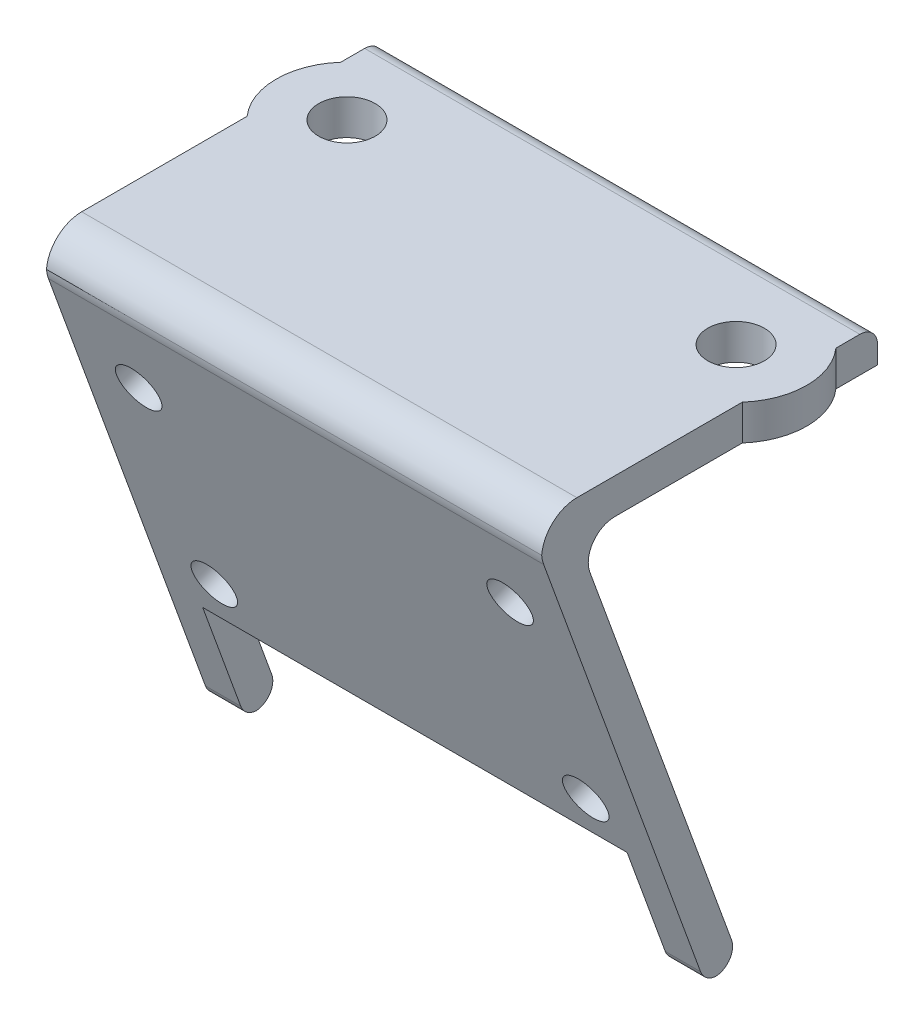
ISO-10303-21;
HEADER;
FILE_DESCRIPTION(('STEP AP214'),'2;1');
FILE_NAME('part.step','',(''),(''),'','','');
FILE_SCHEMA(('AUTOMOTIVE_DESIGN { 1 0 10303 214 1 1 1 1 }'));
ENDSEC;
DATA;
#1=APPLICATION_CONTEXT('core data for automotive mechanical design processes');
#2=APPLICATION_PROTOCOL_DEFINITION('international standard','automotive_design',2000,#1);
#3=PRODUCT_CONTEXT('',#1,'mechanical');
#4=PRODUCT('Part','Part','',(#3));
#5=PRODUCT_RELATED_PRODUCT_CATEGORY('part','',(#4));
#6=PRODUCT_DEFINITION_FORMATION('','',#4);
#7=PRODUCT_DEFINITION_CONTEXT('part definition',#1,'design');
#8=PRODUCT_DEFINITION('design','',#6,#7);
#9=PRODUCT_DEFINITION_SHAPE('','',#8);
#10=(LENGTH_UNIT() NAMED_UNIT(*) SI_UNIT(.MILLI.,.METRE.));
#11=(NAMED_UNIT(*) PLANE_ANGLE_UNIT() SI_UNIT($,.RADIAN.));
#12=(NAMED_UNIT(*) SI_UNIT($,.STERADIAN.) SOLID_ANGLE_UNIT());
#13=UNCERTAINTY_MEASURE_WITH_UNIT(LENGTH_MEASURE(1.E-05),#10,'distance_accuracy_value','');
#14=(GEOMETRIC_REPRESENTATION_CONTEXT(3) GLOBAL_UNCERTAINTY_ASSIGNED_CONTEXT((#13)) GLOBAL_UNIT_ASSIGNED_CONTEXT((#10,
#11,#12)) REPRESENTATION_CONTEXT('',''));
#15=CARTESIAN_POINT('',(0.,0.,0.));
#16=DIRECTION('',(0.,0.,1.));
#17=DIRECTION('',(1.,0.,0.));
#18=AXIS2_PLACEMENT_3D('',#15,#16,#17);
#19=CARTESIAN_POINT('',(-14.,2.,9.5));
#20=DIRECTION('',(1.,0.,0.));
#21=DIRECTION('',(0.,0.,-1.));
#22=AXIS2_PLACEMENT_3D('',#19,#20,#21);
#23=PLANE('',#22);
#24=DIRECTION('',(0.,0.,1.));
#25=VECTOR('',#24,1.);
#26=CARTESIAN_POINT('',(-14.,2.,9.5));
#27=LINE('',#26,#25);
#28=CARTESIAN_POINT('',(-14.,2.,-8.5));
#29=VERTEX_POINT('',#28);
#30=CARTESIAN_POINT('',(-14.,2.,-7.1457513110646));
#31=VERTEX_POINT('',#30);
#32=EDGE_CURVE('E287',#29,#31,#27,.T.);
#33=ORIENTED_EDGE('',*,*,#32,.F.);
#34=CARTESIAN_POINT('',(-14.,1.,-8.5));
#35=DIRECTION('',(1.,0.,0.));
#36=DIRECTION('',(0.,0.,-1.));
#37=AXIS2_PLACEMENT_3D('',#34,#35,#36);
#38=CIRCLE('',#37,1.);
#39=CARTESIAN_POINT('',(-14.,1.,-9.5));
#40=VERTEX_POINT('',#39);
#41=EDGE_CURVE('E57',#29,#40,#38,.F.);
#42=ORIENTED_EDGE('',*,*,#41,.T.);
#43=DIRECTION('',(0.,-1.,0.));
#44=VECTOR('',#43,1.);
#45=CARTESIAN_POINT('',(-14.,2.,-9.5));
#46=LINE('',#45,#44);
#47=CARTESIAN_POINT('',(-14.,0.,-9.5));
#48=VERTEX_POINT('',#47);
#49=EDGE_CURVE('E289',#40,#48,#46,.T.);
#50=ORIENTED_EDGE('',*,*,#49,.T.);
#51=DIRECTION('',(0.,0.,1.));
#52=VECTOR('',#51,1.);
#53=CARTESIAN_POINT('',(-14.,0.,9.5));
#54=LINE('',#53,#52);
#55=CARTESIAN_POINT('',(-14.,0.,-7.1457513110646));
#56=VERTEX_POINT('',#55);
#57=EDGE_CURVE('E296',#48,#56,#54,.T.);
#58=ORIENTED_EDGE('',*,*,#57,.T.);
#59=DIRECTION('',(0.,1.,0.));
#60=VECTOR('',#59,1.);
#61=CARTESIAN_POINT('',(-14.,-11.3137084989848,-7.1457513110646));
#62=LINE('',#61,#60);
#63=EDGE_CURVE('E255',#31,#56,#62,.F.);
#64=ORIENTED_EDGE('',*,*,#63,.F.);
#65=EDGE_LOOP('',(#33,#42,#50,#58,#64));
#66=FACE_BOUND('',#65,.T.);
#67=ADVANCED_FACE('F35',(#66),#23,.F.);
#68=DIRECTION('',(0.,-0.939692620785908,-0.34202014332567));
#69=VECTOR('',#68,1.);
#70=CARTESIAN_POINT('',(-14.,-25.3717007612195,-1.7345438697931));
#71=LINE('',#70,#69);
#72=CARTESIAN_POINT('',(-14.,-2.0130302149885,6.76731692106569));
#73=VERTEX_POINT('',#72);
#74=CARTESIAN_POINT('',(-14.,-24.0296806178938,-1.24608848383689));
#75=VERTEX_POINT('',#74);
#76=EDGE_CURVE('E237',#73,#75,#71,.T.);
#77=ORIENTED_EDGE('',*,*,#76,.T.);
#78=CARTESIAN_POINT('',(-14.,-24.3717007612195,-0.306395863050982));
#79=DIRECTION('',(1.,0.,0.));
#80=DIRECTION('',(0.,0.,-1.));
#81=AXIS2_PLACEMENT_3D('',#78,#79,#80);
#82=CIRCLE('',#81,1.);
#83=CARTESIAN_POINT('',(-14.,-25.3696392430509,-0.370573635526894));
#84=VERTEX_POINT('',#83);
#85=EDGE_CURVE('E341',#75,#84,#82,.F.);
#86=ORIENTED_EDGE('',*,*,#85,.T.);
#87=CARTESIAN_POINT('',(-14.,-24.3717007612195,-0.434751408002806));
#88=DIRECTION('',(1.,0.,0.));
#89=DIRECTION('',(0.,0.,-1.));
#90=AXIS2_PLACEMENT_3D('',#87,#88,#89);
#91=CIRCLE('',#90,1.);
#92=CARTESIAN_POINT('',(-14.,-24.7137209045452,0.5049412127831));
#93=VERTEX_POINT('',#92);
#94=EDGE_CURVE('E339',#84,#93,#91,.F.);
#95=ORIENTED_EDGE('',*,*,#94,.T.);
#96=DIRECTION('',(0.,0.939692620785908,0.34202014332567));
#97=VECTOR('',#96,1.);
#98=CARTESIAN_POINT('',(-14.,0.,9.5));
#99=LINE('',#98,#97);
#100=CARTESIAN_POINT('',(-14.,-0.33138632523441,9.37938524157182));
#101=VERTEX_POINT('',#100);
#102=EDGE_CURVE('E240',#93,#101,#99,.T.);
#103=ORIENTED_EDGE('',*,*,#102,.T.);
#104=CARTESIAN_POINT('',(-14.,0.352653961416931,7.5));
#105=DIRECTION('',(1.,0.,0.));
#106=DIRECTION('',(0.,0.,-1.));
#107=AXIS2_PLACEMENT_3D('',#104,#105,#106);
#108=CIRCLE('',#107,2.);
#109=CARTESIAN_POINT('',(-14.,0.176326980708465,9.49221203587225));
#110=VERTEX_POINT('',#109);
#111=EDGE_CURVE('E306',#101,#110,#108,.F.);
#112=ORIENTED_EDGE('',*,*,#111,.T.);
#113=CARTESIAN_POINT('',(-14.,0.,7.5));
#114=DIRECTION('',(1.,0.,0.));
#115=DIRECTION('',(0.,0.,-1.));
#116=AXIS2_PLACEMENT_3D('',#113,#114,#115);
#117=CIRCLE('',#116,2.);
#118=CARTESIAN_POINT('',(-14.,2.,7.5));
#119=VERTEX_POINT('',#118);
#120=EDGE_CURVE('E308',#110,#119,#117,.F.);
#121=ORIENTED_EDGE('',*,*,#120,.T.);
#122=CARTESIAN_POINT('',(-14.,2.,-1.85424868893541));
#123=VERTEX_POINT('',#122);
#124=EDGE_CURVE('E285',#123,#119,#27,.T.);
#125=ORIENTED_EDGE('',*,*,#124,.F.);
#126=DIRECTION('',(0.,1.,0.));
#127=VECTOR('',#126,1.);
#128=CARTESIAN_POINT('',(-14.,-11.3137084989848,-1.85424868893541));
#129=LINE('',#128,#127);
#130=CARTESIAN_POINT('',(-14.,0.,-1.85424868893541));
#131=VERTEX_POINT('',#130);
#132=EDGE_CURVE('E250',#131,#123,#129,.T.);
#133=ORIENTED_EDGE('',*,*,#132,.F.);
#134=CARTESIAN_POINT('',(-14.,0.,5.35777798988682));
#135=VERTEX_POINT('',#134);
#136=EDGE_CURVE('E295',#131,#135,#54,.T.);
#137=ORIENTED_EDGE('',*,*,#136,.T.);
#138=CARTESIAN_POINT('',(-14.,-1.5,5.35777798988682));
#139=DIRECTION('',(1.,0.,0.));
#140=DIRECTION('',(0.,0.,-1.));
#141=AXIS2_PLACEMENT_3D('',#138,#139,#140);
#142=CIRCLE('',#141,1.5);
#143=EDGE_CURVE('E320',#135,#73,#142,.T.);
#144=ORIENTED_EDGE('',*,*,#143,.T.);
#145=EDGE_LOOP('',(#77,#86,#95,#103,#112,#121,#125,#133,#137,#144));
#146=FACE_BOUND('',#145,.T.);
#147=ADVANCED_FACE('F429',(#146),#23,.F.);
#148=CARTESIAN_POINT('',(14.,2.,9.5));
#149=DIRECTION('',(-1.,0.,0.));
#150=DIRECTION('',(0.,0.,1.));
#151=AXIS2_PLACEMENT_3D('',#148,#149,#150);
#152=PLANE('',#151);
#153=CARTESIAN_POINT('',(14.,-24.3717007612195,-0.434751408002806));
#154=DIRECTION('',(-1.,0.,0.));
#155=DIRECTION('',(0.,0.,1.));
#156=AXIS2_PLACEMENT_3D('',#153,#154,#155);
#157=CIRCLE('',#156,1.);
#158=CARTESIAN_POINT('',(14.,-24.7137209045452,0.504941212783102));
#159=VERTEX_POINT('',#158);
#160=CARTESIAN_POINT('',(14.,-25.3696392430509,-0.370573635526894));
#161=VERTEX_POINT('',#160);
#162=EDGE_CURVE('E322',#159,#161,#157,.F.);
#163=ORIENTED_EDGE('',*,*,#162,.T.);
#164=CARTESIAN_POINT('',(14.,-24.3717007612195,-0.306395863050982));
#165=DIRECTION('',(-1.,0.,0.));
#166=DIRECTION('',(0.,0.,1.));
#167=AXIS2_PLACEMENT_3D('',#164,#165,#166);
#168=CIRCLE('',#167,1.);
#169=CARTESIAN_POINT('',(14.,-24.0296806178938,-1.24608848383689));
#170=VERTEX_POINT('',#169);
#171=EDGE_CURVE('E324',#161,#170,#168,.F.);
#172=ORIENTED_EDGE('',*,*,#171,.T.);
#173=DIRECTION('',(0.,0.939692620785908,0.34202014332567));
#174=VECTOR('',#173,1.);
#175=CARTESIAN_POINT('',(14.,-25.3717007612195,-1.7345438697931));
#176=LINE('',#175,#174);
#177=CARTESIAN_POINT('',(14.,-2.0130302149885,6.76731692106569));
#178=VERTEX_POINT('',#177);
#179=EDGE_CURVE('E241',#170,#178,#176,.T.);
#180=ORIENTED_EDGE('',*,*,#179,.T.);
#181=CARTESIAN_POINT('',(14.,-1.5,5.35777798988682));
#182=DIRECTION('',(-1.,0.,0.));
#183=DIRECTION('',(0.,0.,1.));
#184=AXIS2_PLACEMENT_3D('',#181,#182,#183);
#185=CIRCLE('',#184,1.5);
#186=CARTESIAN_POINT('',(14.,0.,5.35777798988682));
#187=VERTEX_POINT('',#186);
#188=EDGE_CURVE('E318',#178,#187,#185,.T.);
#189=ORIENTED_EDGE('',*,*,#188,.T.);
#190=DIRECTION('',(0.,0.,-1.));
#191=VECTOR('',#190,1.);
#192=CARTESIAN_POINT('',(14.,0.,9.5));
#193=LINE('',#192,#191);
#194=CARTESIAN_POINT('',(14.,0.,-1.85424868893541));
#195=VERTEX_POINT('',#194);
#196=EDGE_CURVE('E290',#187,#195,#193,.T.);
#197=ORIENTED_EDGE('',*,*,#196,.T.);
#198=DIRECTION('',(0.,1.,0.));
#199=VECTOR('',#198,1.);
#200=CARTESIAN_POINT('',(14.,-11.3137084989848,-1.85424868893541));
#201=LINE('',#200,#199);
#202=CARTESIAN_POINT('',(14.,2.,-1.85424868893541));
#203=VERTEX_POINT('',#202);
#204=EDGE_CURVE('E267',#195,#203,#201,.T.);
#205=ORIENTED_EDGE('',*,*,#204,.T.);
#206=DIRECTION('',(0.,0.,-1.));
#207=VECTOR('',#206,1.);
#208=CARTESIAN_POINT('',(14.,2.,9.5));
#209=LINE('',#208,#207);
#210=CARTESIAN_POINT('',(14.,2.,7.5));
#211=VERTEX_POINT('',#210);
#212=EDGE_CURVE('E283',#211,#203,#209,.T.);
#213=ORIENTED_EDGE('',*,*,#212,.F.);
#214=CARTESIAN_POINT('',(14.,0.,7.5));
#215=DIRECTION('',(-1.,0.,0.));
#216=DIRECTION('',(0.,0.,1.));
#217=AXIS2_PLACEMENT_3D('',#214,#215,#216);
#218=CIRCLE('',#217,2.);
#219=CARTESIAN_POINT('',(14.,0.176326980708465,9.49221203587225));
#220=VERTEX_POINT('',#219);
#221=EDGE_CURVE('E304',#211,#220,#218,.F.);
#222=ORIENTED_EDGE('',*,*,#221,.T.);
#223=CARTESIAN_POINT('',(14.,0.352653961416931,7.5));
#224=DIRECTION('',(-1.,0.,0.));
#225=DIRECTION('',(0.,0.,1.));
#226=AXIS2_PLACEMENT_3D('',#223,#224,#225);
#227=CIRCLE('',#226,2.);
#228=CARTESIAN_POINT('',(14.,-0.33138632523441,9.37938524157182));
#229=VERTEX_POINT('',#228);
#230=EDGE_CURVE('E302',#220,#229,#227,.F.);
#231=ORIENTED_EDGE('',*,*,#230,.T.);
#232=DIRECTION('',(0.,-0.939692620785908,-0.34202014332567));
#233=VECTOR('',#232,1.);
#234=CARTESIAN_POINT('',(14.,0.,9.5));
#235=LINE('',#234,#233);
#236=EDGE_CURVE('E236',#229,#159,#235,.T.);
#237=ORIENTED_EDGE('',*,*,#236,.T.);
#238=EDGE_LOOP('',(#163,#172,#180,#189,#197,#205,#213,#222,#231,#237));
#239=FACE_BOUND('',#238,.T.);
#240=ADVANCED_FACE('F379',(#239),#152,.F.);
#241=DIRECTION('',(0.,-1.,0.));
#242=VECTOR('',#241,1.);
#243=CARTESIAN_POINT('',(14.,2.,-9.5));
#244=LINE('',#243,#242);
#245=CARTESIAN_POINT('',(14.,1.,-9.5));
#246=VERTEX_POINT('',#245);
#247=CARTESIAN_POINT('',(14.,0.,-9.5));
#248=VERTEX_POINT('',#247);
#249=EDGE_CURVE('E182',#246,#248,#244,.T.);
#250=ORIENTED_EDGE('',*,*,#249,.F.);
#251=CARTESIAN_POINT('',(14.,1.,-8.5));
#252=DIRECTION('',(-1.,0.,0.));
#253=DIRECTION('',(0.,0.,1.));
#254=AXIS2_PLACEMENT_3D('',#251,#252,#253);
#255=CIRCLE('',#254,1.);
#256=CARTESIAN_POINT('',(14.,2.,-8.5));
#257=VERTEX_POINT('',#256);
#258=EDGE_CURVE('E11',#246,#257,#255,.F.);
#259=ORIENTED_EDGE('',*,*,#258,.T.);
#260=CARTESIAN_POINT('',(14.,2.,-7.14575131106459));
#261=VERTEX_POINT('',#260);
#262=EDGE_CURVE('E286',#261,#257,#209,.T.);
#263=ORIENTED_EDGE('',*,*,#262,.F.);
#264=DIRECTION('',(0.,1.,0.));
#265=VECTOR('',#264,1.);
#266=CARTESIAN_POINT('',(14.,-11.3137084989848,-7.14575131106459));
#267=LINE('',#266,#265);
#268=CARTESIAN_POINT('',(14.,0.,-7.14575131106459));
#269=VERTEX_POINT('',#268);
#270=EDGE_CURVE('E262',#261,#269,#267,.F.);
#271=ORIENTED_EDGE('',*,*,#270,.T.);
#272=EDGE_CURVE('E274',#269,#248,#193,.T.);
#273=ORIENTED_EDGE('',*,*,#272,.T.);
#274=EDGE_LOOP('',(#250,#259,#263,#271,#273));
#275=FACE_BOUND('',#274,.T.);
#276=ADVANCED_FACE('F419',(#275),#152,.F.);
#277=CARTESIAN_POINT('',(-14.,2.,-9.5));
#278=DIRECTION('',(0.,0.,1.));
#279=DIRECTION('',(1.,0.,0.));
#280=AXIS2_PLACEMENT_3D('',#277,#278,#279);
#281=PLANE('',#280);
#282=ORIENTED_EDGE('',*,*,#49,.F.);
#283=DIRECTION('',(-1.,0.,0.));
#284=VECTOR('',#283,1.);
#285=CARTESIAN_POINT('',(-14.,1.,-9.5));
#286=LINE('',#285,#284);
#287=EDGE_CURVE('E43',#40,#246,#286,.F.);
#288=ORIENTED_EDGE('',*,*,#287,.T.);
#289=ORIENTED_EDGE('',*,*,#249,.T.);
#290=DIRECTION('',(-1.,0.,0.));
#291=VECTOR('',#290,1.);
#292=CARTESIAN_POINT('',(-14.,0.,-9.5));
#293=LINE('',#292,#291);
#294=EDGE_CURVE('E292',#248,#48,#293,.T.);
#295=ORIENTED_EDGE('',*,*,#294,.T.);
#296=EDGE_LOOP('',(#282,#288,#289,#295));
#297=FACE_BOUND('',#296,.T.);
#298=ADVANCED_FACE('F437',(#297),#281,.F.);
#299=CARTESIAN_POINT('',(0.,2.,0.));
#300=DIRECTION('',(0.,-1.,0.));
#301=DIRECTION('',(0.,0.,-1.));
#302=AXIS2_PLACEMENT_3D('',#299,#300,#301);
#303=PLANE('',#302);
#304=CARTESIAN_POINT('',(-11.,2.,-4.5));
#305=DIRECTION('',(0.,1.,0.));
#306=DIRECTION('',(0.,0.,-1.));
#307=AXIS2_PLACEMENT_3D('',#304,#305,#306);
#308=CIRCLE('',#307,1.6);
#309=CARTESIAN_POINT('',(-11.,2.,-6.1));
#310=VERTEX_POINT('',#309);
#311=EDGE_CURVE('E270',#310,#310,#308,.T.);
#312=ORIENTED_EDGE('',*,*,#311,.F.);
#313=EDGE_LOOP('',(#312));
#314=FACE_BOUND('',#313,.T.);
#315=ORIENTED_EDGE('',*,*,#262,.T.);
#316=DIRECTION('',(-1.,0.,0.));
#317=VECTOR('',#316,1.);
#318=CARTESIAN_POINT('',(0.,2.,-8.5));
#319=LINE('',#318,#317);
#320=EDGE_CURVE('E347',#257,#29,#319,.T.);
#321=ORIENTED_EDGE('',*,*,#320,.T.);
#322=ORIENTED_EDGE('',*,*,#32,.T.);
#323=CARTESIAN_POINT('',(-11.,2.,-4.5));
#324=DIRECTION('',(0.,-1.,0.));
#325=DIRECTION('',(0.,0.,1.));
#326=AXIS2_PLACEMENT_3D('',#323,#324,#325);
#327=CIRCLE('',#326,4.);
#328=EDGE_CURVE('E246',#123,#31,#327,.T.);
#329=ORIENTED_EDGE('',*,*,#328,.F.);
#330=ORIENTED_EDGE('',*,*,#124,.T.);
#331=DIRECTION('',(1.,0.,0.));
#332=VECTOR('',#331,1.);
#333=CARTESIAN_POINT('',(0.,2.,7.5));
#334=LINE('',#333,#332);
#335=EDGE_CURVE('E181',#119,#211,#334,.T.);
#336=ORIENTED_EDGE('',*,*,#335,.T.);
#337=ORIENTED_EDGE('',*,*,#212,.T.);
#338=CARTESIAN_POINT('',(11.,2.,-4.5));
#339=DIRECTION('',(0.,1.,0.));
#340=DIRECTION('',(0.,0.,1.));
#341=AXIS2_PLACEMENT_3D('',#338,#339,#340);
#342=CIRCLE('',#341,4.);
#343=EDGE_CURVE('E259',#203,#261,#342,.T.);
#344=ORIENTED_EDGE('',*,*,#343,.T.);
#345=EDGE_LOOP('',(#315,#321,#322,#329,#330,#336,#337,#344));
#346=FACE_BOUND('',#345,.T.);
#347=CARTESIAN_POINT('',(11.,2.,-4.5));
#348=DIRECTION('',(0.,1.,0.));
#349=DIRECTION('',(0.,0.,1.));
#350=AXIS2_PLACEMENT_3D('',#347,#348,#349);
#351=CIRCLE('',#350,1.6);
#352=CARTESIAN_POINT('',(11.,2.,-2.9));
#353=VERTEX_POINT('',#352);
#354=EDGE_CURVE('E275',#353,#353,#351,.T.);
#355=ORIENTED_EDGE('',*,*,#354,.F.);
#356=EDGE_LOOP('',(#355));
#357=FACE_BOUND('',#356,.T.);
#358=ADVANCED_FACE('F358',(#314,#346,#357),#303,.F.);
#359=CARTESIAN_POINT('',(0.,0.,0.));
#360=DIRECTION('',(0.,-1.,0.));
#361=DIRECTION('',(0.,0.,-1.));
#362=AXIS2_PLACEMENT_3D('',#359,#360,#361);
#363=PLANE('',#362);
#364=ORIENTED_EDGE('',*,*,#196,.F.);
#365=DIRECTION('',(1.,0.,0.));
#366=VECTOR('',#365,1.);
#367=CARTESIAN_POINT('',(-14.,0.,5.35777798988682));
#368=LINE('',#367,#366);
#369=EDGE_CURVE('E316',#187,#135,#368,.F.);
#370=ORIENTED_EDGE('',*,*,#369,.T.);
#371=ORIENTED_EDGE('',*,*,#136,.F.);
#372=CARTESIAN_POINT('',(-11.,0.,-4.5));
#373=DIRECTION('',(0.,-1.,0.));
#374=DIRECTION('',(0.,0.,-1.));
#375=AXIS2_PLACEMENT_3D('',#372,#373,#374);
#376=CIRCLE('',#375,4.);
#377=EDGE_CURVE('E247',#131,#56,#376,.T.);
#378=ORIENTED_EDGE('',*,*,#377,.T.);
#379=ORIENTED_EDGE('',*,*,#57,.F.);
#380=ORIENTED_EDGE('',*,*,#294,.F.);
#381=ORIENTED_EDGE('',*,*,#272,.F.);
#382=CARTESIAN_POINT('',(11.,0.,-4.5));
#383=DIRECTION('',(0.,-1.,0.));
#384=DIRECTION('',(0.,0.,-1.));
#385=AXIS2_PLACEMENT_3D('',#382,#383,#384);
#386=CIRCLE('',#385,4.);
#387=EDGE_CURVE('E258',#195,#269,#386,.F.);
#388=ORIENTED_EDGE('',*,*,#387,.F.);
#389=EDGE_LOOP('',(#364,#370,#371,#378,#379,#380,#381,#388));
#390=FACE_BOUND('',#389,.T.);
#391=CARTESIAN_POINT('',(-11.,0.,-4.5));
#392=DIRECTION('',(0.,1.,0.));
#393=DIRECTION('',(0.,0.,-1.));
#394=AXIS2_PLACEMENT_3D('',#391,#392,#393);
#395=CIRCLE('',#394,1.6);
#396=CARTESIAN_POINT('',(-11.,0.,-6.1));
#397=VERTEX_POINT('',#396);
#398=EDGE_CURVE('E278',#397,#397,#395,.T.);
#399=ORIENTED_EDGE('',*,*,#398,.T.);
#400=EDGE_LOOP('',(#399));
#401=FACE_BOUND('',#400,.T.);
#402=CARTESIAN_POINT('',(11.,0.,-4.5));
#403=DIRECTION('',(0.,1.,0.));
#404=DIRECTION('',(0.,0.,1.));
#405=AXIS2_PLACEMENT_3D('',#402,#403,#404);
#406=CIRCLE('',#405,1.6);
#407=CARTESIAN_POINT('',(11.,0.,-2.9));
#408=VERTEX_POINT('',#407);
#409=EDGE_CURVE('E271',#408,#408,#406,.T.);
#410=ORIENTED_EDGE('',*,*,#409,.T.);
#411=EDGE_LOOP('',(#410));
#412=FACE_BOUND('',#411,.T.);
#413=ADVANCED_FACE('F409',(#390,#401,#412),#363,.T.);
#414=CARTESIAN_POINT('',(-11.,0.,-4.5));
#415=DIRECTION('',(0.,1.,0.));
#416=DIRECTION('',(0.,0.,1.));
#417=AXIS2_PLACEMENT_3D('',#414,#415,#416);
#418=CYLINDRICAL_SURFACE('',#417,1.6);
#419=ORIENTED_EDGE('',*,*,#398,.F.);
#420=EDGE_LOOP('',(#419));
#421=FACE_BOUND('',#420,.T.);
#422=ORIENTED_EDGE('',*,*,#311,.T.);
#423=EDGE_LOOP('',(#422));
#424=FACE_BOUND('',#423,.T.);
#425=ADVANCED_FACE('F499',(#421,#424),#418,.F.);
#426=CARTESIAN_POINT('',(11.,0.,-4.5));
#427=DIRECTION('',(0.,1.,0.));
#428=DIRECTION('',(0.,0.,1.));
#429=AXIS2_PLACEMENT_3D('',#426,#427,#428);
#430=CYLINDRICAL_SURFACE('',#429,1.6);
#431=ORIENTED_EDGE('',*,*,#409,.F.);
#432=EDGE_LOOP('',(#431));
#433=FACE_BOUND('',#432,.T.);
#434=ORIENTED_EDGE('',*,*,#354,.T.);
#435=EDGE_LOOP('',(#434));
#436=FACE_BOUND('',#435,.T.);
#437=ADVANCED_FACE('F496',(#433,#436),#430,.F.);
#438=CARTESIAN_POINT('',(11.,-11.3137084989848,-4.5));
#439=DIRECTION('',(0.,1.,0.));
#440=DIRECTION('',(0.,0.,1.));
#441=AXIS2_PLACEMENT_3D('',#438,#439,#440);
#442=CYLINDRICAL_SURFACE('',#441,4.);
#443=ORIENTED_EDGE('',*,*,#204,.F.);
#444=ORIENTED_EDGE('',*,*,#387,.T.);
#445=ORIENTED_EDGE('',*,*,#270,.F.);
#446=ORIENTED_EDGE('',*,*,#343,.F.);
#447=EDGE_LOOP('',(#443,#444,#445,#446));
#448=FACE_BOUND('',#447,.T.);
#449=ADVANCED_FACE('F416',(#448),#442,.T.);
#450=CARTESIAN_POINT('',(-11.,-11.3137084989848,-4.5));
#451=DIRECTION('',(0.,1.,0.));
#452=DIRECTION('',(0.,0.,1.));
#453=AXIS2_PLACEMENT_3D('',#450,#451,#452);
#454=CYLINDRICAL_SURFACE('',#453,4.);
#455=ORIENTED_EDGE('',*,*,#328,.T.);
#456=ORIENTED_EDGE('',*,*,#63,.T.);
#457=ORIENTED_EDGE('',*,*,#377,.F.);
#458=ORIENTED_EDGE('',*,*,#132,.T.);
#459=EDGE_LOOP('',(#455,#456,#457,#458));
#460=FACE_BOUND('',#459,.T.);
#461=ADVANCED_FACE('F367',(#460),#454,.T.);
#462=CARTESIAN_POINT('',(-41.7477598281226,-25.3717007612195,-1.7345438697931));
#463=DIRECTION('',(0.,0.34202014332567,-0.939692620785908));
#464=DIRECTION('',(0.,0.939692620785908,0.34202014332567));
#465=AXIS2_PLACEMENT_3D('',#462,#463,#464);
#466=PLANE('',#465);
#467=ORIENTED_EDGE('',*,*,#179,.F.);
#468=DIRECTION('',(1.,0.,0.));
#469=VECTOR('',#468,1.);
#470=CARTESIAN_POINT('',(-41.7477598281226,-24.0296806178938,-1.24608848383689));
#471=LINE('',#470,#469);
#472=CARTESIAN_POINT('',(12.,-24.0296806178938,-1.24608848383689));
#473=VERTEX_POINT('',#472);
#474=EDGE_CURVE('E329',#170,#473,#471,.F.);
#475=ORIENTED_EDGE('',*,*,#474,.T.);
#476=DIRECTION('',(0.,-0.939692620785908,-0.34202014332567));
#477=VECTOR('',#476,1.);
#478=CARTESIAN_POINT('',(12.,-25.3717007612195,-1.7345438697931));
#479=LINE('',#478,#477);
#480=CARTESIAN_POINT('',(12.,-18.1510648060316,0.893552690367616));
#481=VERTEX_POINT('',#480);
#482=EDGE_CURVE('E206',#481,#473,#479,.T.);
#483=ORIENTED_EDGE('',*,*,#482,.F.);
#484=DIRECTION('',(1.,0.,0.));
#485=VECTOR('',#484,1.);
#486=CARTESIAN_POINT('',(-41.7477598281226,-18.1510648060316,0.893552690367619));
#487=LINE('',#486,#485);
#488=CARTESIAN_POINT('',(-12.,-18.1510648060316,0.893552690367616));
#489=VERTEX_POINT('',#488);
#490=EDGE_CURVE('E191',#489,#481,#487,.T.);
#491=ORIENTED_EDGE('',*,*,#490,.F.);
#492=DIRECTION('',(0.,0.939692620785908,0.34202014332567));
#493=VECTOR('',#492,1.);
#494=CARTESIAN_POINT('',(-12.,-25.3717007612195,-1.7345438697931));
#495=LINE('',#494,#493);
#496=CARTESIAN_POINT('',(-12.,-24.0296806178938,-1.24608848383689));
#497=VERTEX_POINT('',#496);
#498=EDGE_CURVE('E210',#497,#489,#495,.T.);
#499=ORIENTED_EDGE('',*,*,#498,.F.);
#500=DIRECTION('',(1.,0.,0.));
#501=VECTOR('',#500,1.);
#502=CARTESIAN_POINT('',(-41.7477598281226,-24.0296806178938,-1.24608848383689));
#503=LINE('',#502,#501);
#504=EDGE_CURVE('E326',#497,#75,#503,.F.);
#505=ORIENTED_EDGE('',*,*,#504,.T.);
#506=ORIENTED_EDGE('',*,*,#76,.F.);
#507=DIRECTION('',(1.,0.,0.));
#508=VECTOR('',#507,1.);
#509=CARTESIAN_POINT('',(14.,-2.01303021498851,6.76731692106569));
#510=LINE('',#509,#508);
#511=EDGE_CURVE('E312',#73,#178,#510,.T.);
#512=ORIENTED_EDGE('',*,*,#511,.T.);
#513=EDGE_LOOP('',(#467,#475,#483,#491,#499,#505,#506,#512));
#514=FACE_BOUND('',#513,.T.);
#515=CARTESIAN_POINT('',(10.5,-4.09013910854779,6.0113111104805));
#516=DIRECTION('',(0.,0.34202014332567,-0.939692620785908));
#517=DIRECTION('',(0.,0.939692620785908,0.34202014332567));
#518=AXIS2_PLACEMENT_3D('',#515,#516,#517);
#519=CIRCLE('',#518,1.24999999999999);
#520=CARTESIAN_POINT('',(10.5,-2.91552333256541,6.43883628963758));
#521=VERTEX_POINT('',#520);
#522=EDGE_CURVE('E224',#521,#521,#519,.F.);
#523=ORIENTED_EDGE('',*,*,#522,.T.);
#524=EDGE_LOOP('',(#523));
#525=FACE_BOUND('',#524,.T.);
#526=CARTESIAN_POINT('',(10.5,-15.8362968683717,1.73605931890961));
#527=DIRECTION('',(0.,0.34202014332567,-0.939692620785908));
#528=DIRECTION('',(0.,0.939692620785908,0.34202014332567));
#529=AXIS2_PLACEMENT_3D('',#526,#527,#528);
#530=CIRCLE('',#529,1.25);
#531=CARTESIAN_POINT('',(10.5,-14.6616810923893,2.1635844980667));
#532=VERTEX_POINT('',#531);
#533=EDGE_CURVE('E217',#532,#532,#530,.F.);
#534=ORIENTED_EDGE('',*,*,#533,.T.);
#535=EDGE_LOOP('',(#534));
#536=FACE_BOUND('',#535,.T.);
#537=CARTESIAN_POINT('',(-10.5,-15.8362968683716,1.73605931890962));
#538=DIRECTION('',(0.,0.34202014332567,-0.939692620785908));
#539=DIRECTION('',(0.,0.939692620785908,0.34202014332567));
#540=AXIS2_PLACEMENT_3D('',#537,#538,#539);
#541=CIRCLE('',#540,1.25);
#542=CARTESIAN_POINT('',(-10.5,-14.6616810923893,2.1635844980667));
#543=VERTEX_POINT('',#542);
#544=EDGE_CURVE('E216',#543,#543,#541,.F.);
#545=ORIENTED_EDGE('',*,*,#544,.T.);
#546=EDGE_LOOP('',(#545));
#547=FACE_BOUND('',#546,.T.);
#548=CARTESIAN_POINT('',(-10.5,-4.09013910854779,6.0113111104805));
#549=DIRECTION('',(0.,0.34202014332567,-0.939692620785908));
#550=DIRECTION('',(0.,0.939692620785908,0.34202014332567));
#551=AXIS2_PLACEMENT_3D('',#548,#549,#550);
#552=CIRCLE('',#551,1.25);
#553=CARTESIAN_POINT('',(-10.5,-2.91552333256541,6.43883628963759));
#554=VERTEX_POINT('',#553);
#555=EDGE_CURVE('E233',#554,#554,#552,.F.);
#556=ORIENTED_EDGE('',*,*,#555,.T.);
#557=EDGE_LOOP('',(#556));
#558=FACE_BOUND('',#557,.T.);
#559=ADVANCED_FACE('F397',(#514,#525,#536,#547,#558),#466,.T.);
#560=CARTESIAN_POINT('',(-41.7477598281226,0.,9.5));
#561=DIRECTION('',(0.,-0.34202014332567,0.939692620785908));
#562=DIRECTION('',(0.,-0.939692620785908,-0.34202014332567));
#563=AXIS2_PLACEMENT_3D('',#560,#561,#562);
#564=PLANE('',#563);
#565=ORIENTED_EDGE('',*,*,#102,.F.);
#566=DIRECTION('',(1.,0.,0.));
#567=VECTOR('',#566,1.);
#568=CARTESIAN_POINT('',(-41.7477598281226,-24.7137209045452,0.504941212783102));
#569=LINE('',#568,#567);
#570=CARTESIAN_POINT('',(-12.,-24.7137209045452,0.504941212783099));
#571=VERTEX_POINT('',#570);
#572=EDGE_CURVE('E345',#93,#571,#569,.T.);
#573=ORIENTED_EDGE('',*,*,#572,.T.);
#574=DIRECTION('',(0.,-0.939692620785908,-0.34202014332567));
#575=VECTOR('',#574,1.);
#576=CARTESIAN_POINT('',(-12.,-25.3717007612195,0.2654561302069));
#577=LINE('',#576,#575);
#578=CARTESIAN_POINT('',(-12.,-18.7938524157182,2.65959713348659));
#579=VERTEX_POINT('',#578);
#580=EDGE_CURVE('E193',#579,#571,#577,.T.);
#581=ORIENTED_EDGE('',*,*,#580,.F.);
#582=DIRECTION('',(-1.,0.,0.));
#583=VECTOR('',#582,1.);
#584=CARTESIAN_POINT('',(-12.,-18.7938524157182,2.65959713348659));
#585=LINE('',#584,#583);
#586=CARTESIAN_POINT('',(12.,-18.7938524157182,2.65959713348659));
#587=VERTEX_POINT('',#586);
#588=EDGE_CURVE('E188',#587,#579,#585,.T.);
#589=ORIENTED_EDGE('',*,*,#588,.F.);
#590=DIRECTION('',(0.,0.939692620785908,0.34202014332567));
#591=VECTOR('',#590,1.);
#592=CARTESIAN_POINT('',(12.,0.,9.5));
#593=LINE('',#592,#591);
#594=CARTESIAN_POINT('',(12.,-24.7137209045452,0.5049412127831));
#595=VERTEX_POINT('',#594);
#596=EDGE_CURVE('E170',#595,#587,#593,.T.);
#597=ORIENTED_EDGE('',*,*,#596,.F.);
#598=DIRECTION('',(1.,0.,0.));
#599=VECTOR('',#598,1.);
#600=CARTESIAN_POINT('',(-41.7477598281226,-24.7137209045452,0.504941212783102));
#601=LINE('',#600,#599);
#602=EDGE_CURVE('E343',#595,#159,#601,.T.);
#603=ORIENTED_EDGE('',*,*,#602,.T.);
#604=ORIENTED_EDGE('',*,*,#236,.F.);
#605=DIRECTION('',(1.,0.,0.));
#606=VECTOR('',#605,1.);
#607=CARTESIAN_POINT('',(-14.,-0.331386325234409,9.37938524157182));
#608=LINE('',#607,#606);
#609=EDGE_CURVE('E310',#229,#101,#608,.F.);
#610=ORIENTED_EDGE('',*,*,#609,.T.);
#611=EDGE_LOOP('',(#565,#573,#581,#589,#597,#603,#604,#610));
#612=FACE_BOUND('',#611,.T.);
#613=CARTESIAN_POINT('',(10.5,-4.73292671823433,7.77735555359948));
#614=DIRECTION('',(0.,-0.34202014332567,0.939692620785908));
#615=DIRECTION('',(0.,0.939692620785908,0.34202014332567));
#616=AXIS2_PLACEMENT_3D('',#613,#614,#615);
#617=CIRCLE('',#616,1.24999999999999);
#618=CARTESIAN_POINT('',(10.5,-3.55831094225195,8.20488073275656));
#619=VERTEX_POINT('',#618);
#620=EDGE_CURVE('E212',#619,#619,#617,.T.);
#621=ORIENTED_EDGE('',*,*,#620,.F.);
#622=EDGE_LOOP('',(#621));
#623=FACE_BOUND('',#622,.T.);
#624=CARTESIAN_POINT('',(10.5,-16.4790844780582,3.50210376202859));
#625=DIRECTION('',(0.,-0.34202014332567,0.939692620785908));
#626=DIRECTION('',(0.,0.939692620785908,0.34202014332567));
#627=AXIS2_PLACEMENT_3D('',#624,#625,#626);
#628=CIRCLE('',#627,1.25);
#629=CARTESIAN_POINT('',(10.5,-15.3044687020758,3.92962894118568));
#630=VERTEX_POINT('',#629);
#631=EDGE_CURVE('E221',#630,#630,#628,.T.);
#632=ORIENTED_EDGE('',*,*,#631,.F.);
#633=EDGE_LOOP('',(#632));
#634=FACE_BOUND('',#633,.T.);
#635=CARTESIAN_POINT('',(-10.5,-16.4790844780582,3.50210376202859));
#636=DIRECTION('',(0.,-0.34202014332567,0.939692620785908));
#637=DIRECTION('',(0.,-0.939692620785908,-0.34202014332567));
#638=AXIS2_PLACEMENT_3D('',#635,#636,#637);
#639=CIRCLE('',#638,1.25);
#640=CARTESIAN_POINT('',(-10.5,-17.6537002540406,3.07457858287151));
#641=VERTEX_POINT('',#640);
#642=EDGE_CURVE('E213',#641,#641,#639,.T.);
#643=ORIENTED_EDGE('',*,*,#642,.F.);
#644=EDGE_LOOP('',(#643));
#645=FACE_BOUND('',#644,.T.);
#646=CARTESIAN_POINT('',(-10.5,-4.73292671823433,7.77735555359948));
#647=DIRECTION('',(0.,-0.34202014332567,0.939692620785908));
#648=DIRECTION('',(0.,-0.939692620785908,-0.34202014332567));
#649=AXIS2_PLACEMENT_3D('',#646,#647,#648);
#650=CIRCLE('',#649,1.25);
#651=CARTESIAN_POINT('',(-10.5,-5.90754249421672,7.34983037444239));
#652=VERTEX_POINT('',#651);
#653=EDGE_CURVE('E220',#652,#652,#650,.T.);
#654=ORIENTED_EDGE('',*,*,#653,.F.);
#655=EDGE_LOOP('',(#654));
#656=FACE_BOUND('',#655,.T.);
#657=ADVANCED_FACE('F196',(#612,#623,#634,#645,#656),#564,.T.);
#658=CARTESIAN_POINT('',(-10.5,-2.88091529530791,2.68899598853713));
#659=DIRECTION('',(0.,-0.34202014332567,0.939692620785908));
#660=DIRECTION('',(0.,-0.939692620785908,-0.34202014332567));
#661=AXIS2_PLACEMENT_3D('',#658,#659,#660);
#662=CYLINDRICAL_SURFACE('',#661,1.25);
#663=ORIENTED_EDGE('',*,*,#653,.T.);
#664=EDGE_LOOP('',(#663));
#665=FACE_BOUND('',#664,.T.);
#666=ORIENTED_EDGE('',*,*,#555,.F.);
#667=EDGE_LOOP('',(#666));
#668=FACE_BOUND('',#667,.T.);
#669=ADVANCED_FACE('F480',(#665,#668),#662,.F.);
#670=CARTESIAN_POINT('',(-10.5,-14.6270730551318,-1.58625580303375));
#671=DIRECTION('',(0.,-0.34202014332567,0.939692620785908));
#672=DIRECTION('',(0.,-0.939692620785908,-0.34202014332567));
#673=AXIS2_PLACEMENT_3D('',#670,#671,#672);
#674=CYLINDRICAL_SURFACE('',#673,1.25);
#675=ORIENTED_EDGE('',*,*,#642,.T.);
#676=EDGE_LOOP('',(#675));
#677=FACE_BOUND('',#676,.T.);
#678=ORIENTED_EDGE('',*,*,#544,.F.);
#679=EDGE_LOOP('',(#678));
#680=FACE_BOUND('',#679,.T.);
#681=ADVANCED_FACE('F477',(#677,#680),#674,.F.);
#682=CARTESIAN_POINT('',(10.5,-14.6270730551318,-1.58625580303376));
#683=DIRECTION('',(0.,-0.34202014332567,0.939692620785908));
#684=DIRECTION('',(0.,-0.939692620785908,-0.34202014332567));
#685=AXIS2_PLACEMENT_3D('',#682,#683,#684);
#686=CYLINDRICAL_SURFACE('',#685,1.25);
#687=ORIENTED_EDGE('',*,*,#631,.T.);
#688=EDGE_LOOP('',(#687));
#689=FACE_BOUND('',#688,.T.);
#690=ORIENTED_EDGE('',*,*,#533,.F.);
#691=EDGE_LOOP('',(#690));
#692=FACE_BOUND('',#691,.T.);
#693=ADVANCED_FACE('F471',(#689,#692),#686,.F.);
#694=CARTESIAN_POINT('',(10.5,-2.8809152953079,2.68899598853713));
#695=DIRECTION('',(0.,-0.34202014332567,0.939692620785908));
#696=DIRECTION('',(0.,-0.939692620785908,-0.34202014332567));
#697=AXIS2_PLACEMENT_3D('',#694,#695,#696);
#698=CYLINDRICAL_SURFACE('',#697,1.24999999999999);
#699=ORIENTED_EDGE('',*,*,#620,.T.);
#700=EDGE_LOOP('',(#699));
#701=FACE_BOUND('',#700,.T.);
#702=ORIENTED_EDGE('',*,*,#522,.F.);
#703=EDGE_LOOP('',(#702));
#704=FACE_BOUND('',#703,.T.);
#705=ADVANCED_FACE('F464',(#701,#704),#698,.F.);
#706=CARTESIAN_POINT('',(-12.,-19.0312629123163,-17.1547536891099));
#707=DIRECTION('',(-1.,0.,0.));
#708=DIRECTION('',(0.,0.,1.));
#709=AXIS2_PLACEMENT_3D('',#706,#707,#708);
#710=PLANE('',#709);
#711=CARTESIAN_POINT('',(-12.,-24.3717007612195,-0.434751408002806));
#712=DIRECTION('',(-1.,0.,0.));
#713=DIRECTION('',(0.,0.,1.));
#714=AXIS2_PLACEMENT_3D('',#711,#712,#713);
#715=CIRCLE('',#714,1.);
#716=CARTESIAN_POINT('',(-12.,-25.3696392430509,-0.370573635526894));
#717=VERTEX_POINT('',#716);
#718=EDGE_CURVE('E335',#571,#717,#715,.F.);
#719=ORIENTED_EDGE('',*,*,#718,.T.);
#720=CARTESIAN_POINT('',(-12.,-24.3717007612195,-0.306395863050982));
#721=DIRECTION('',(-1.,0.,0.));
#722=DIRECTION('',(0.,0.,1.));
#723=AXIS2_PLACEMENT_3D('',#720,#721,#722);
#724=CIRCLE('',#723,1.);
#725=EDGE_CURVE('E337',#717,#497,#724,.F.);
#726=ORIENTED_EDGE('',*,*,#725,.T.);
#727=ORIENTED_EDGE('',*,*,#498,.T.);
#728=DIRECTION('',(0.,-0.34202014332567,0.939692620785908));
#729=VECTOR('',#728,1.);
#730=CARTESIAN_POINT('',(-12.,-12.453414566815,-14.7606126858302));
#731=LINE('',#730,#729);
#732=EDGE_CURVE('E192',#489,#579,#731,.T.);
#733=ORIENTED_EDGE('',*,*,#732,.T.);
#734=ORIENTED_EDGE('',*,*,#580,.T.);
#735=EDGE_LOOP('',(#719,#726,#727,#733,#734));
#736=FACE_BOUND('',#735,.T.);
#737=ADVANCED_FACE('F459',(#736),#710,.F.);
#738=CARTESIAN_POINT('',(-12.,-12.453414566815,-14.7606126858302));
#739=DIRECTION('',(0.,0.939692620785908,0.34202014332567));
#740=DIRECTION('',(0.,-0.34202014332567,0.939692620785908));
#741=AXIS2_PLACEMENT_3D('',#738,#739,#740);
#742=PLANE('',#741);
#743=ORIENTED_EDGE('',*,*,#490,.T.);
#744=DIRECTION('',(0.,-0.34202014332567,0.939692620785908));
#745=VECTOR('',#744,1.);
#746=CARTESIAN_POINT('',(12.,-12.453414566815,-14.7606126858302));
#747=LINE('',#746,#745);
#748=EDGE_CURVE('E174',#481,#587,#747,.T.);
#749=ORIENTED_EDGE('',*,*,#748,.T.);
#750=ORIENTED_EDGE('',*,*,#588,.T.);
#751=ORIENTED_EDGE('',*,*,#732,.F.);
#752=EDGE_LOOP('',(#743,#749,#750,#751));
#753=FACE_BOUND('',#752,.T.);
#754=ADVANCED_FACE('F186',(#753),#742,.F.);
#755=CARTESIAN_POINT('',(12.,-19.0312629123163,-17.1547536891099));
#756=DIRECTION('',(1.,0.,0.));
#757=DIRECTION('',(0.,0.,-1.));
#758=AXIS2_PLACEMENT_3D('',#755,#756,#757);
#759=PLANE('',#758);
#760=ORIENTED_EDGE('',*,*,#482,.T.);
#761=CARTESIAN_POINT('',(12.,-24.3717007612195,-0.306395863050982));
#762=DIRECTION('',(1.,0.,0.));
#763=DIRECTION('',(0.,0.,-1.));
#764=AXIS2_PLACEMENT_3D('',#761,#762,#763);
#765=CIRCLE('',#764,1.);
#766=CARTESIAN_POINT('',(12.,-25.3696392430509,-0.370573635526894));
#767=VERTEX_POINT('',#766);
#768=EDGE_CURVE('E333',#473,#767,#765,.F.);
#769=ORIENTED_EDGE('',*,*,#768,.T.);
#770=CARTESIAN_POINT('',(12.,-24.3717007612195,-0.434751408002806));
#771=DIRECTION('',(1.,0.,0.));
#772=DIRECTION('',(0.,0.,-1.));
#773=AXIS2_PLACEMENT_3D('',#770,#771,#772);
#774=CIRCLE('',#773,1.);
#775=EDGE_CURVE('E177',#767,#595,#774,.F.);
#776=ORIENTED_EDGE('',*,*,#775,.T.);
#777=ORIENTED_EDGE('',*,*,#596,.T.);
#778=ORIENTED_EDGE('',*,*,#748,.F.);
#779=EDGE_LOOP('',(#760,#769,#776,#777,#778));
#780=FACE_BOUND('',#779,.T.);
#781=ADVANCED_FACE('F173',(#780),#759,.F.);
#782=CARTESIAN_POINT('',(-14.,0.352653961416931,7.5));
#783=DIRECTION('',(-1.,0.,0.));
#784=DIRECTION('',(0.,0.,1.));
#785=AXIS2_PLACEMENT_3D('',#782,#783,#784);
#786=CYLINDRICAL_SURFACE('',#785,2.);
#787=DIRECTION('',(-1.,0.,0.));
#788=VECTOR('',#787,1.);
#789=CARTESIAN_POINT('',(0.,0.176326980708465,9.49221203587225));
#790=LINE('',#789,#788);
#791=EDGE_CURVE('E199',#110,#220,#790,.F.);
#792=ORIENTED_EDGE('',*,*,#791,.F.);
#793=ORIENTED_EDGE('',*,*,#111,.F.);
#794=ORIENTED_EDGE('',*,*,#609,.F.);
#795=ORIENTED_EDGE('',*,*,#230,.F.);
#796=EDGE_LOOP('',(#792,#793,#794,#795));
#797=FACE_BOUND('',#796,.T.);
#798=ADVANCED_FACE('F383',(#797),#786,.T.);
#799=CARTESIAN_POINT('',(0.,0.,7.5));
#800=DIRECTION('',(1.,0.,0.));
#801=DIRECTION('',(0.,0.,-1.));
#802=AXIS2_PLACEMENT_3D('',#799,#800,#801);
#803=CYLINDRICAL_SURFACE('',#802,2.);
#804=ORIENTED_EDGE('',*,*,#120,.F.);
#805=ORIENTED_EDGE('',*,*,#791,.T.);
#806=ORIENTED_EDGE('',*,*,#221,.F.);
#807=ORIENTED_EDGE('',*,*,#335,.F.);
#808=EDGE_LOOP('',(#804,#805,#806,#807));
#809=FACE_BOUND('',#808,.T.);
#810=ADVANCED_FACE('F375',(#809),#803,.T.);
#811=CARTESIAN_POINT('',(-41.7477598281226,-1.5,5.35777798988682));
#812=DIRECTION('',(-1.,0.,0.));
#813=DIRECTION('',(0.,0.,1.));
#814=AXIS2_PLACEMENT_3D('',#811,#812,#813);
#815=CYLINDRICAL_SURFACE('',#814,1.5);
#816=ORIENTED_EDGE('',*,*,#143,.F.);
#817=ORIENTED_EDGE('',*,*,#369,.F.);
#818=ORIENTED_EDGE('',*,*,#188,.F.);
#819=ORIENTED_EDGE('',*,*,#511,.F.);
#820=EDGE_LOOP('',(#816,#817,#818,#819));
#821=FACE_BOUND('',#820,.T.);
#822=ADVANCED_FACE('F403',(#821),#815,.F.);
#823=CARTESIAN_POINT('',(-41.7477598281226,-24.3717007612195,-0.434751408002806));
#824=DIRECTION('',(1.,0.,0.));
#825=DIRECTION('',(0.,0.,-1.));
#826=AXIS2_PLACEMENT_3D('',#823,#824,#825);
#827=CYLINDRICAL_SURFACE('',#826,1.);
#828=ORIENTED_EDGE('',*,*,#602,.F.);
#829=ORIENTED_EDGE('',*,*,#775,.F.);
#830=DIRECTION('',(1.,0.,0.));
#831=VECTOR('',#830,1.);
#832=CARTESIAN_POINT('',(13.,-25.3696392430509,-0.370573635526894));
#833=LINE('',#832,#831);
#834=EDGE_CURVE('E203',#161,#767,#833,.F.);
#835=ORIENTED_EDGE('',*,*,#834,.F.);
#836=ORIENTED_EDGE('',*,*,#162,.F.);
#837=EDGE_LOOP('',(#828,#829,#835,#836));
#838=FACE_BOUND('',#837,.T.);
#839=ADVANCED_FACE('F389',(#838),#827,.T.);
#840=CARTESIAN_POINT('',(-41.7477598281226,-24.3717007612195,-0.306395863050982));
#841=DIRECTION('',(1.,0.,0.));
#842=DIRECTION('',(0.,0.,-1.));
#843=AXIS2_PLACEMENT_3D('',#840,#841,#842);
#844=CYLINDRICAL_SURFACE('',#843,1.);
#845=ORIENTED_EDGE('',*,*,#768,.F.);
#846=ORIENTED_EDGE('',*,*,#474,.F.);
#847=ORIENTED_EDGE('',*,*,#171,.F.);
#848=ORIENTED_EDGE('',*,*,#834,.T.);
#849=EDGE_LOOP('',(#845,#846,#847,#848));
#850=FACE_BOUND('',#849,.T.);
#851=ADVANCED_FACE('F393',(#850),#844,.T.);
#852=CARTESIAN_POINT('',(-41.7477598281226,-24.3717007612195,-0.434751408002806));
#853=DIRECTION('',(1.,0.,0.));
#854=DIRECTION('',(0.,0.,-1.));
#855=AXIS2_PLACEMENT_3D('',#852,#853,#854);
#856=CYLINDRICAL_SURFACE('',#855,1.);
#857=ORIENTED_EDGE('',*,*,#572,.F.);
#858=ORIENTED_EDGE('',*,*,#94,.F.);
#859=DIRECTION('',(1.,0.,0.));
#860=VECTOR('',#859,1.);
#861=CARTESIAN_POINT('',(-13.,-25.3696392430509,-0.370573635526894));
#862=LINE('',#861,#860);
#863=EDGE_CURVE('E350',#717,#84,#862,.F.);
#864=ORIENTED_EDGE('',*,*,#863,.F.);
#865=ORIENTED_EDGE('',*,*,#718,.F.);
#866=EDGE_LOOP('',(#857,#858,#864,#865));
#867=FACE_BOUND('',#866,.T.);
#868=ADVANCED_FACE('F425',(#867),#856,.T.);
#869=CARTESIAN_POINT('',(-41.7477598281226,-24.3717007612195,-0.306395863050982));
#870=DIRECTION('',(1.,0.,0.));
#871=DIRECTION('',(0.,0.,-1.));
#872=AXIS2_PLACEMENT_3D('',#869,#870,#871);
#873=CYLINDRICAL_SURFACE('',#872,1.);
#874=ORIENTED_EDGE('',*,*,#85,.F.);
#875=ORIENTED_EDGE('',*,*,#504,.F.);
#876=ORIENTED_EDGE('',*,*,#725,.F.);
#877=ORIENTED_EDGE('',*,*,#863,.T.);
#878=EDGE_LOOP('',(#874,#875,#876,#877));
#879=FACE_BOUND('',#878,.T.);
#880=ADVANCED_FACE('F421',(#879),#873,.T.);
#881=CARTESIAN_POINT('',(0.,1.,-8.5));
#882=DIRECTION('',(-1.,0.,0.));
#883=DIRECTION('',(0.,0.,1.));
#884=AXIS2_PLACEMENT_3D('',#881,#882,#883);
#885=CYLINDRICAL_SURFACE('',#884,1.);
#886=ORIENTED_EDGE('',*,*,#258,.F.);
#887=ORIENTED_EDGE('',*,*,#287,.F.);
#888=ORIENTED_EDGE('',*,*,#41,.F.);
#889=ORIENTED_EDGE('',*,*,#320,.F.);
#890=EDGE_LOOP('',(#886,#887,#888,#889));
#891=FACE_BOUND('',#890,.T.);
#892=ADVANCED_FACE('F37',(#891),#885,.T.);
#893=CLOSED_SHELL('',(#67,#147,#240,#276,#298,#358,#413,#425,#437,#449,#461,#559,#657,#669,#681,
#693,#705,#737,#754,#781,#798,#810,#822,#839,#851,#868,#880,#892));
#894=MANIFOLD_SOLID_BREP('B2',#893);
#895=ADVANCED_BREP_SHAPE_REPRESENTATION('',(#18,#894),#14);
#896=SHAPE_DEFINITION_REPRESENTATION(#9,#895);
ENDSEC;
END-ISO-10303-21;
